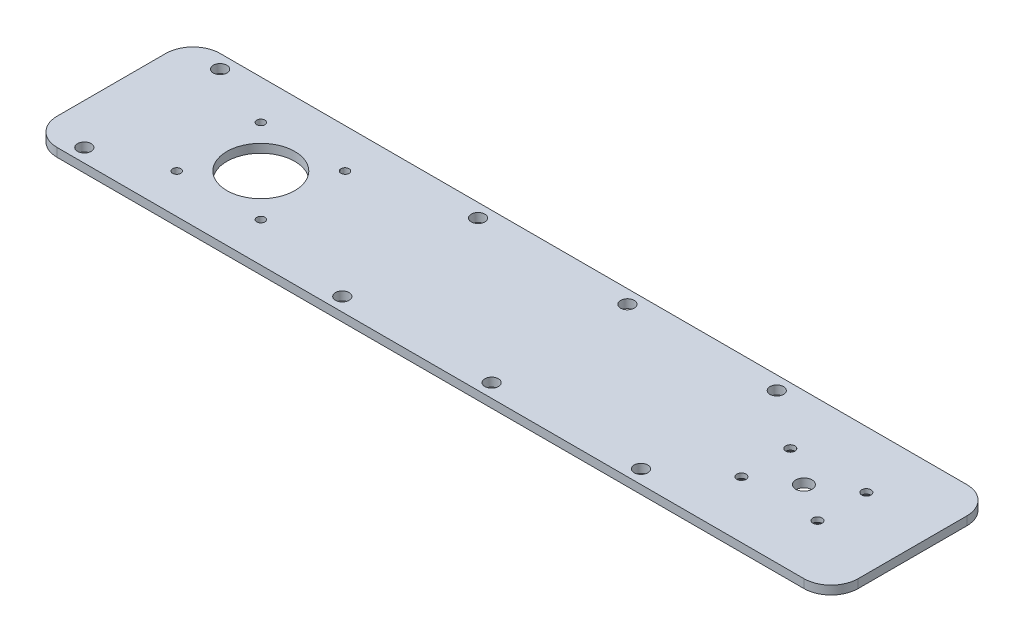
ISO-10303-21;
HEADER;
FILE_DESCRIPTION(('STEP AP214'),'2;1');
FILE_NAME('part.step','',(''),(''),'','','');
FILE_SCHEMA(('AUTOMOTIVE_DESIGN { 1 0 10303 214 1 1 1 1 }'));
ENDSEC;
DATA;
#1=APPLICATION_CONTEXT('core data for automotive mechanical design processes');
#2=APPLICATION_PROTOCOL_DEFINITION('international standard','automotive_design',2000,#1);
#3=PRODUCT_CONTEXT('',#1,'mechanical');
#4=PRODUCT('Part','Part','',(#3));
#5=PRODUCT_RELATED_PRODUCT_CATEGORY('part','',(#4));
#6=PRODUCT_DEFINITION_FORMATION('','',#4);
#7=PRODUCT_DEFINITION_CONTEXT('part definition',#1,'design');
#8=PRODUCT_DEFINITION('design','',#6,#7);
#9=PRODUCT_DEFINITION_SHAPE('','',#8);
#10=(LENGTH_UNIT() NAMED_UNIT(*) SI_UNIT(.MILLI.,.METRE.));
#11=(NAMED_UNIT(*) PLANE_ANGLE_UNIT() SI_UNIT($,.RADIAN.));
#12=(NAMED_UNIT(*) SI_UNIT($,.STERADIAN.) SOLID_ANGLE_UNIT());
#13=UNCERTAINTY_MEASURE_WITH_UNIT(LENGTH_MEASURE(1.E-05),#10,'distance_accuracy_value','');
#14=(GEOMETRIC_REPRESENTATION_CONTEXT(3) GLOBAL_UNCERTAINTY_ASSIGNED_CONTEXT((#13)) GLOBAL_UNIT_ASSIGNED_CONTEXT((#10,
#11,#12)) REPRESENTATION_CONTEXT('',''));
#15=CARTESIAN_POINT('',(0.,0.,0.));
#16=DIRECTION('',(0.,0.,1.));
#17=DIRECTION('',(1.,0.,0.));
#18=AXIS2_PLACEMENT_3D('',#15,#16,#17);
#19=CARTESIAN_POINT('',(0.,0.,0.));
#20=DIRECTION('',(0.,1.,0.));
#21=DIRECTION('',(0.,0.,1.));
#22=AXIS2_PLACEMENT_3D('',#19,#20,#21);
#23=PLANE('',#22);
#24=CARTESIAN_POINT('',(55.,0.,25.));
#25=DIRECTION('',(0.,1.,0.));
#26=DIRECTION('',(0.,0.,1.));
#27=AXIS2_PLACEMENT_3D('',#24,#25,#26);
#28=CIRCLE('',#27,2.5);
#29=CARTESIAN_POINT('',(55.,0.,27.5));
#30=VERTEX_POINT('',#29);
#31=EDGE_CURVE('E361',#30,#30,#28,.T.);
#32=ORIENTED_EDGE('',*,*,#31,.T.);
#33=EDGE_LOOP('',(#32));
#34=FACE_BOUND('',#33,.T.);
#35=CARTESIAN_POINT('',(110.,0.,25.));
#36=DIRECTION('',(0.,1.,0.));
#37=DIRECTION('',(0.,0.,1.));
#38=AXIS2_PLACEMENT_3D('',#35,#36,#37);
#39=CIRCLE('',#38,2.5);
#40=CARTESIAN_POINT('',(110.,0.,27.5));
#41=VERTEX_POINT('',#40);
#42=EDGE_CURVE('E353',#41,#41,#39,.T.);
#43=ORIENTED_EDGE('',*,*,#42,.T.);
#44=EDGE_LOOP('',(#43));
#45=FACE_BOUND('',#44,.T.);
#46=CARTESIAN_POINT('',(165.,0.,25.));
#47=DIRECTION('',(0.,1.,0.));
#48=DIRECTION('',(0.,0.,1.));
#49=AXIS2_PLACEMENT_3D('',#46,#47,#48);
#50=CIRCLE('',#49,2.5);
#51=CARTESIAN_POINT('',(165.,0.,27.5));
#52=VERTEX_POINT('',#51);
#53=EDGE_CURVE('E345',#52,#52,#50,.T.);
#54=ORIENTED_EDGE('',*,*,#53,.T.);
#55=EDGE_LOOP('',(#54));
#56=FACE_BOUND('',#55,.T.);
#57=CARTESIAN_POINT('',(165.,0.,-25.));
#58=DIRECTION('',(0.,1.,0.));
#59=DIRECTION('',(0.,0.,1.));
#60=AXIS2_PLACEMENT_3D('',#57,#58,#59);
#61=CIRCLE('',#60,2.5);
#62=CARTESIAN_POINT('',(165.,0.,-22.5));
#63=VERTEX_POINT('',#62);
#64=EDGE_CURVE('E337',#63,#63,#61,.T.);
#65=ORIENTED_EDGE('',*,*,#64,.T.);
#66=EDGE_LOOP('',(#65));
#67=FACE_BOUND('',#66,.T.);
#68=CARTESIAN_POINT('',(110.,0.,-25.));
#69=DIRECTION('',(0.,1.,0.));
#70=DIRECTION('',(0.,0.,1.));
#71=AXIS2_PLACEMENT_3D('',#68,#69,#70);
#72=CIRCLE('',#71,2.5);
#73=CARTESIAN_POINT('',(110.,0.,-22.5));
#74=VERTEX_POINT('',#73);
#75=EDGE_CURVE('E329',#74,#74,#72,.T.);
#76=ORIENTED_EDGE('',*,*,#75,.T.);
#77=EDGE_LOOP('',(#76));
#78=FACE_BOUND('',#77,.T.);
#79=CARTESIAN_POINT('',(55.,0.,-25.));
#80=DIRECTION('',(0.,1.,0.));
#81=DIRECTION('',(0.,0.,1.));
#82=AXIS2_PLACEMENT_3D('',#79,#80,#81);
#83=CIRCLE('',#82,2.5);
#84=CARTESIAN_POINT('',(55.,0.,-22.5));
#85=VERTEX_POINT('',#84);
#86=EDGE_CURVE('E321',#85,#85,#83,.T.);
#87=ORIENTED_EDGE('',*,*,#86,.T.);
#88=EDGE_LOOP('',(#87));
#89=FACE_BOUND('',#88,.T.);
#90=CARTESIAN_POINT('',(-40.,0.,25.));
#91=DIRECTION('',(0.,1.,0.));
#92=DIRECTION('',(0.,0.,1.));
#93=AXIS2_PLACEMENT_3D('',#90,#91,#92);
#94=CIRCLE('',#93,2.5);
#95=CARTESIAN_POINT('',(-40.,0.,27.5));
#96=VERTEX_POINT('',#95);
#97=EDGE_CURVE('E313',#96,#96,#94,.T.);
#98=ORIENTED_EDGE('',*,*,#97,.T.);
#99=EDGE_LOOP('',(#98));
#100=FACE_BOUND('',#99,.T.);
#101=CARTESIAN_POINT('',(-40.,0.,-25.));
#102=DIRECTION('',(0.,1.,0.));
#103=DIRECTION('',(0.,0.,1.));
#104=AXIS2_PLACEMENT_3D('',#101,#102,#103);
#105=CIRCLE('',#104,2.5);
#106=CARTESIAN_POINT('',(-40.,0.,-22.5));
#107=VERTEX_POINT('',#106);
#108=EDGE_CURVE('E305',#107,#107,#105,.T.);
#109=ORIENTED_EDGE('',*,*,#108,.T.);
#110=EDGE_LOOP('',(#109));
#111=FACE_BOUND('',#110,.T.);
#112=CARTESIAN_POINT('',(200.,0.,0.));
#113=DIRECTION('',(0.,1.,0.));
#114=DIRECTION('',(0.,0.,1.));
#115=AXIS2_PLACEMENT_3D('',#112,#113,#114);
#116=CIRCLE('',#115,3.);
#117=CARTESIAN_POINT('',(200.,0.,3.));
#118=VERTEX_POINT('',#117);
#119=EDGE_CURVE('E246',#118,#118,#116,.T.);
#120=ORIENTED_EDGE('',*,*,#119,.T.);
#121=EDGE_LOOP('',(#120));
#122=FACE_BOUND('',#121,.T.);
#123=CARTESIAN_POINT('',(0.,0.,0.));
#124=DIRECTION('',(0.,1.,0.));
#125=DIRECTION('',(0.,0.,1.));
#126=AXIS2_PLACEMENT_3D('',#123,#124,#125);
#127=CIRCLE('',#126,12.5);
#128=CARTESIAN_POINT('',(0.,0.,12.5));
#129=VERTEX_POINT('',#128);
#130=EDGE_CURVE('E241',#129,#129,#127,.T.);
#131=ORIENTED_EDGE('',*,*,#130,.T.);
#132=EDGE_LOOP('',(#131));
#133=FACE_BOUND('',#132,.T.);
#134=CARTESIAN_POINT('',(-15.5,0.,-15.5));
#135=DIRECTION('',(0.,1.,0.));
#136=DIRECTION('',(0.,0.,1.));
#137=AXIS2_PLACEMENT_3D('',#134,#135,#136);
#138=CIRCLE('',#137,1.5);
#139=CARTESIAN_POINT('',(-15.5,0.,-14.));
#140=VERTEX_POINT('',#139);
#141=EDGE_CURVE('E233',#140,#140,#138,.T.);
#142=ORIENTED_EDGE('',*,*,#141,.T.);
#143=EDGE_LOOP('',(#142));
#144=FACE_BOUND('',#143,.T.);
#145=CARTESIAN_POINT('',(15.5,0.,-15.5000000000002));
#146=DIRECTION('',(0.,1.,0.));
#147=DIRECTION('',(0.,0.,1.));
#148=AXIS2_PLACEMENT_3D('',#145,#146,#147);
#149=CIRCLE('',#148,1.5);
#150=CARTESIAN_POINT('',(15.5,0.,-14.0000000000002));
#151=VERTEX_POINT('',#150);
#152=EDGE_CURVE('E225',#151,#151,#149,.T.);
#153=ORIENTED_EDGE('',*,*,#152,.T.);
#154=EDGE_LOOP('',(#153));
#155=FACE_BOUND('',#154,.T.);
#156=CARTESIAN_POINT('',(15.5,0.,15.4999999999998));
#157=DIRECTION('',(0.,1.,0.));
#158=DIRECTION('',(0.,0.,1.));
#159=AXIS2_PLACEMENT_3D('',#156,#157,#158);
#160=CIRCLE('',#159,1.5);
#161=CARTESIAN_POINT('',(15.5,0.,16.9999999999998));
#162=VERTEX_POINT('',#161);
#163=EDGE_CURVE('E217',#162,#162,#160,.T.);
#164=ORIENTED_EDGE('',*,*,#163,.T.);
#165=EDGE_LOOP('',(#164));
#166=FACE_BOUND('',#165,.T.);
#167=CARTESIAN_POINT('',(-15.5,0.,15.5000000000002));
#168=DIRECTION('',(0.,1.,0.));
#169=DIRECTION('',(0.,0.,1.));
#170=AXIS2_PLACEMENT_3D('',#167,#168,#169);
#171=CIRCLE('',#170,1.5);
#172=CARTESIAN_POINT('',(-15.5,0.,17.0000000000002));
#173=VERTEX_POINT('',#172);
#174=EDGE_CURVE('E144',#173,#173,#171,.T.);
#175=ORIENTED_EDGE('',*,*,#174,.T.);
#176=EDGE_LOOP('',(#175));
#177=FACE_BOUND('',#176,.T.);
#178=DIRECTION('',(1.,0.,0.));
#179=VECTOR('',#178,1.);
#180=CARTESIAN_POINT('',(-55.,0.,30.));
#181=LINE('',#180,#179);
#182=CARTESIAN_POINT('',(-45.,0.,30.));
#183=VERTEX_POINT('',#182);
#184=CARTESIAN_POINT('',(230.,0.,30.));
#185=VERTEX_POINT('',#184);
#186=EDGE_CURVE('E124',#183,#185,#181,.T.);
#187=ORIENTED_EDGE('',*,*,#186,.F.);
#188=CARTESIAN_POINT('',(-45.,0.,20.));
#189=DIRECTION('',(0.,1.,0.));
#190=DIRECTION('',(0.,0.,1.));
#191=AXIS2_PLACEMENT_3D('',#188,#189,#190);
#192=CIRCLE('',#191,10.);
#193=CARTESIAN_POINT('',(-55.,0.,20.));
#194=VERTEX_POINT('',#193);
#195=EDGE_CURVE('E106',#183,#194,#192,.F.);
#196=ORIENTED_EDGE('',*,*,#195,.T.);
#197=DIRECTION('',(0.,0.,1.));
#198=VECTOR('',#197,1.);
#199=CARTESIAN_POINT('',(-55.,0.,-30.));
#200=LINE('',#199,#198);
#201=CARTESIAN_POINT('',(-55.,0.,-20.));
#202=VERTEX_POINT('',#201);
#203=EDGE_CURVE('E137',#202,#194,#200,.T.);
#204=ORIENTED_EDGE('',*,*,#203,.F.);
#205=CARTESIAN_POINT('',(-45.,0.,-20.));
#206=DIRECTION('',(0.,1.,0.));
#207=DIRECTION('',(0.,0.,1.));
#208=AXIS2_PLACEMENT_3D('',#205,#206,#207);
#209=CIRCLE('',#208,10.);
#210=CARTESIAN_POINT('',(-45.,0.,-30.));
#211=VERTEX_POINT('',#210);
#212=EDGE_CURVE('E118',#202,#211,#209,.F.);
#213=ORIENTED_EDGE('',*,*,#212,.T.);
#214=DIRECTION('',(-1.,0.,0.));
#215=VECTOR('',#214,1.);
#216=CARTESIAN_POINT('',(-55.,0.,-30.));
#217=LINE('',#216,#215);
#218=CARTESIAN_POINT('',(230.,0.,-30.));
#219=VERTEX_POINT('',#218);
#220=EDGE_CURVE('E142',#219,#211,#217,.T.);
#221=ORIENTED_EDGE('',*,*,#220,.F.);
#222=CARTESIAN_POINT('',(230.,0.,-20.));
#223=DIRECTION('',(0.,1.,0.));
#224=DIRECTION('',(0.,0.,1.));
#225=AXIS2_PLACEMENT_3D('',#222,#223,#224);
#226=CIRCLE('',#225,10.);
#227=CARTESIAN_POINT('',(240.,0.,-20.));
#228=VERTEX_POINT('',#227);
#229=EDGE_CURVE('E129',#219,#228,#226,.F.);
#230=ORIENTED_EDGE('',*,*,#229,.T.);
#231=DIRECTION('',(0.,0.,-1.));
#232=VECTOR('',#231,1.);
#233=CARTESIAN_POINT('',(240.,0.,-30.));
#234=LINE('',#233,#232);
#235=CARTESIAN_POINT('',(240.,0.,20.));
#236=VERTEX_POINT('',#235);
#237=EDGE_CURVE('E136',#236,#228,#234,.T.);
#238=ORIENTED_EDGE('',*,*,#237,.F.);
#239=CARTESIAN_POINT('',(230.,0.,20.));
#240=DIRECTION('',(0.,1.,0.));
#241=DIRECTION('',(0.,0.,1.));
#242=AXIS2_PLACEMENT_3D('',#239,#240,#241);
#243=CIRCLE('',#242,10.);
#244=EDGE_CURVE('E134',#236,#185,#243,.F.);
#245=ORIENTED_EDGE('',*,*,#244,.T.);
#246=EDGE_LOOP('',(#187,#196,#204,#213,#221,#230,#238,#245));
#247=FACE_BOUND('',#246,.T.);
#248=CARTESIAN_POINT('',(214.,0.,9.));
#249=DIRECTION('',(0.,-1.,0.));
#250=DIRECTION('',(0.,0.,-1.));
#251=AXIS2_PLACEMENT_3D('',#248,#249,#250);
#252=CIRCLE('',#251,3.15000000000001);
#253=CARTESIAN_POINT('',(214.,0.,5.84999999999999));
#254=VERTEX_POINT('',#253);
#255=EDGE_CURVE('E265',#254,#254,#252,.T.);
#256=ORIENTED_EDGE('',*,*,#255,.F.);
#257=EDGE_LOOP('',(#256));
#258=FACE_BOUND('',#257,.T.);
#259=CARTESIAN_POINT('',(186.,0.,9.));
#260=DIRECTION('',(0.,-1.,0.));
#261=DIRECTION('',(0.,0.,-1.));
#262=AXIS2_PLACEMENT_3D('',#259,#260,#261);
#263=CIRCLE('',#262,3.14999999999999);
#264=CARTESIAN_POINT('',(186.,0.,5.85000000000001));
#265=VERTEX_POINT('',#264);
#266=EDGE_CURVE('E277',#265,#265,#263,.T.);
#267=ORIENTED_EDGE('',*,*,#266,.F.);
#268=EDGE_LOOP('',(#267));
#269=FACE_BOUND('',#268,.T.);
#270=CARTESIAN_POINT('',(186.,0.,-9.));
#271=DIRECTION('',(0.,-1.,0.));
#272=DIRECTION('',(0.,0.,-1.));
#273=AXIS2_PLACEMENT_3D('',#270,#271,#272);
#274=CIRCLE('',#273,3.15000000000001);
#275=CARTESIAN_POINT('',(186.,0.,-12.15));
#276=VERTEX_POINT('',#275);
#277=EDGE_CURVE('E289',#276,#276,#274,.T.);
#278=ORIENTED_EDGE('',*,*,#277,.F.);
#279=EDGE_LOOP('',(#278));
#280=FACE_BOUND('',#279,.T.);
#281=CARTESIAN_POINT('',(214.,0.,-9.));
#282=DIRECTION('',(0.,-1.,0.));
#283=DIRECTION('',(0.,0.,-1.));
#284=AXIS2_PLACEMENT_3D('',#281,#282,#283);
#285=CIRCLE('',#284,3.14999999999999);
#286=CARTESIAN_POINT('',(214.,0.,-12.15));
#287=VERTEX_POINT('',#286);
#288=EDGE_CURVE('E301',#287,#287,#285,.T.);
#289=ORIENTED_EDGE('',*,*,#288,.F.);
#290=EDGE_LOOP('',(#289));
#291=FACE_BOUND('',#290,.T.);
#292=ADVANCED_FACE('F38',(#34,#45,#56,#67,#78,#89,#100,#111,#122,#133,#144,#155,#166,#177,#247,
#258,#269,#280,#291),#23,.F.);
#293=CARTESIAN_POINT('',(-55.,3.175,-30.));
#294=DIRECTION('',(1.,0.,0.));
#295=DIRECTION('',(0.,0.,-1.));
#296=AXIS2_PLACEMENT_3D('',#293,#294,#295);
#297=PLANE('',#296);
#298=ORIENTED_EDGE('',*,*,#203,.T.);
#299=DIRECTION('',(0.,-1.,0.));
#300=VECTOR('',#299,1.);
#301=CARTESIAN_POINT('',(-55.,3.175,20.));
#302=LINE('',#301,#300);
#303=CARTESIAN_POINT('',(-55.,3.175,20.));
#304=VERTEX_POINT('',#303);
#305=EDGE_CURVE('E111',#194,#304,#302,.F.);
#306=ORIENTED_EDGE('',*,*,#305,.T.);
#307=DIRECTION('',(0.,0.,1.));
#308=VECTOR('',#307,1.);
#309=CARTESIAN_POINT('',(-55.,3.175,-30.));
#310=LINE('',#309,#308);
#311=CARTESIAN_POINT('',(-55.,3.175,-20.));
#312=VERTEX_POINT('',#311);
#313=EDGE_CURVE('E150',#312,#304,#310,.T.);
#314=ORIENTED_EDGE('',*,*,#313,.F.);
#315=DIRECTION('',(0.,-1.,0.));
#316=VECTOR('',#315,1.);
#317=CARTESIAN_POINT('',(-55.,3.175,-20.));
#318=LINE('',#317,#316);
#319=EDGE_CURVE('E117',#312,#202,#318,.T.);
#320=ORIENTED_EDGE('',*,*,#319,.T.);
#321=EDGE_LOOP('',(#298,#306,#314,#320));
#322=FACE_BOUND('',#321,.T.);
#323=ADVANCED_FACE('F203',(#322),#297,.F.);
#324=CARTESIAN_POINT('',(-55.,3.175,30.));
#325=DIRECTION('',(0.,0.,-1.));
#326=DIRECTION('',(-1.,0.,0.));
#327=AXIS2_PLACEMENT_3D('',#324,#325,#326);
#328=PLANE('',#327);
#329=DIRECTION('',(1.,0.,0.));
#330=VECTOR('',#329,1.);
#331=CARTESIAN_POINT('',(-55.,3.175,30.));
#332=LINE('',#331,#330);
#333=CARTESIAN_POINT('',(-45.,3.175,30.));
#334=VERTEX_POINT('',#333);
#335=CARTESIAN_POINT('',(230.,3.175,30.));
#336=VERTEX_POINT('',#335);
#337=EDGE_CURVE('E127',#334,#336,#332,.T.);
#338=ORIENTED_EDGE('',*,*,#337,.F.);
#339=DIRECTION('',(0.,-1.,0.));
#340=VECTOR('',#339,1.);
#341=CARTESIAN_POINT('',(-45.,3.175,30.));
#342=LINE('',#341,#340);
#343=EDGE_CURVE('E110',#334,#183,#342,.T.);
#344=ORIENTED_EDGE('',*,*,#343,.T.);
#345=ORIENTED_EDGE('',*,*,#186,.T.);
#346=DIRECTION('',(0.,-1.,0.));
#347=VECTOR('',#346,1.);
#348=CARTESIAN_POINT('',(230.,3.175,30.));
#349=LINE('',#348,#347);
#350=EDGE_CURVE('E130',#185,#336,#349,.F.);
#351=ORIENTED_EDGE('',*,*,#350,.T.);
#352=EDGE_LOOP('',(#338,#344,#345,#351));
#353=FACE_BOUND('',#352,.T.);
#354=ADVANCED_FACE('F123',(#353),#328,.F.);
#355=CARTESIAN_POINT('',(240.,3.175,-30.));
#356=DIRECTION('',(-1.,0.,0.));
#357=DIRECTION('',(0.,0.,1.));
#358=AXIS2_PLACEMENT_3D('',#355,#356,#357);
#359=PLANE('',#358);
#360=DIRECTION('',(0.,0.,-1.));
#361=VECTOR('',#360,1.);
#362=CARTESIAN_POINT('',(240.,3.175,-30.));
#363=LINE('',#362,#361);
#364=CARTESIAN_POINT('',(240.,3.175,20.));
#365=VERTEX_POINT('',#364);
#366=CARTESIAN_POINT('',(240.,3.175,-20.));
#367=VERTEX_POINT('',#366);
#368=EDGE_CURVE('E186',#365,#367,#363,.T.);
#369=ORIENTED_EDGE('',*,*,#368,.F.);
#370=DIRECTION('',(0.,-1.,0.));
#371=VECTOR('',#370,1.);
#372=CARTESIAN_POINT('',(240.,3.175,20.));
#373=LINE('',#372,#371);
#374=EDGE_CURVE('E11',#365,#236,#373,.T.);
#375=ORIENTED_EDGE('',*,*,#374,.T.);
#376=ORIENTED_EDGE('',*,*,#237,.T.);
#377=DIRECTION('',(0.,-1.,0.));
#378=VECTOR('',#377,1.);
#379=CARTESIAN_POINT('',(240.,3.175,-20.));
#380=LINE('',#379,#378);
#381=EDGE_CURVE('E47',#228,#367,#380,.F.);
#382=ORIENTED_EDGE('',*,*,#381,.T.);
#383=EDGE_LOOP('',(#369,#375,#376,#382));
#384=FACE_BOUND('',#383,.T.);
#385=ADVANCED_FACE('F185',(#384),#359,.F.);
#386=CARTESIAN_POINT('',(-55.,3.175,-30.));
#387=DIRECTION('',(0.,0.,1.));
#388=DIRECTION('',(1.,0.,0.));
#389=AXIS2_PLACEMENT_3D('',#386,#387,#388);
#390=PLANE('',#389);
#391=ORIENTED_EDGE('',*,*,#220,.T.);
#392=DIRECTION('',(0.,-1.,0.));
#393=VECTOR('',#392,1.);
#394=CARTESIAN_POINT('',(-45.,3.175,-30.));
#395=LINE('',#394,#393);
#396=CARTESIAN_POINT('',(-45.,3.175,-30.));
#397=VERTEX_POINT('',#396);
#398=EDGE_CURVE('E54',#211,#397,#395,.F.);
#399=ORIENTED_EDGE('',*,*,#398,.T.);
#400=DIRECTION('',(-1.,0.,0.));
#401=VECTOR('',#400,1.);
#402=CARTESIAN_POINT('',(-55.,3.175,-30.));
#403=LINE('',#402,#401);
#404=CARTESIAN_POINT('',(230.,3.175,-30.));
#405=VERTEX_POINT('',#404);
#406=EDGE_CURVE('E152',#405,#397,#403,.T.);
#407=ORIENTED_EDGE('',*,*,#406,.F.);
#408=DIRECTION('',(0.,-1.,0.));
#409=VECTOR('',#408,1.);
#410=CARTESIAN_POINT('',(230.,3.175,-30.));
#411=LINE('',#410,#409);
#412=EDGE_CURVE('E176',#405,#219,#411,.T.);
#413=ORIENTED_EDGE('',*,*,#412,.T.);
#414=EDGE_LOOP('',(#391,#399,#407,#413));
#415=FACE_BOUND('',#414,.T.);
#416=ADVANCED_FACE('F196',(#415),#390,.F.);
#417=CARTESIAN_POINT('',(0.,3.175,0.));
#418=DIRECTION('',(0.,1.,0.));
#419=DIRECTION('',(0.,0.,1.));
#420=AXIS2_PLACEMENT_3D('',#417,#418,#419);
#421=PLANE('',#420);
#422=CARTESIAN_POINT('',(55.,3.175,25.));
#423=DIRECTION('',(0.,1.,0.));
#424=DIRECTION('',(0.,0.,1.));
#425=AXIS2_PLACEMENT_3D('',#422,#423,#424);
#426=CIRCLE('',#425,2.5);
#427=CARTESIAN_POINT('',(55.,3.175,27.5));
#428=VERTEX_POINT('',#427);
#429=EDGE_CURVE('E365',#428,#428,#426,.T.);
#430=ORIENTED_EDGE('',*,*,#429,.F.);
#431=EDGE_LOOP('',(#430));
#432=FACE_BOUND('',#431,.T.);
#433=CARTESIAN_POINT('',(110.,3.175,25.));
#434=DIRECTION('',(0.,1.,0.));
#435=DIRECTION('',(0.,0.,1.));
#436=AXIS2_PLACEMENT_3D('',#433,#434,#435);
#437=CIRCLE('',#436,2.5);
#438=CARTESIAN_POINT('',(110.,3.175,27.5));
#439=VERTEX_POINT('',#438);
#440=EDGE_CURVE('E357',#439,#439,#437,.T.);
#441=ORIENTED_EDGE('',*,*,#440,.F.);
#442=EDGE_LOOP('',(#441));
#443=FACE_BOUND('',#442,.T.);
#444=CARTESIAN_POINT('',(165.,3.175,25.));
#445=DIRECTION('',(0.,1.,0.));
#446=DIRECTION('',(0.,0.,1.));
#447=AXIS2_PLACEMENT_3D('',#444,#445,#446);
#448=CIRCLE('',#447,2.5);
#449=CARTESIAN_POINT('',(165.,3.175,27.5));
#450=VERTEX_POINT('',#449);
#451=EDGE_CURVE('E349',#450,#450,#448,.T.);
#452=ORIENTED_EDGE('',*,*,#451,.F.);
#453=EDGE_LOOP('',(#452));
#454=FACE_BOUND('',#453,.T.);
#455=CARTESIAN_POINT('',(165.,3.175,-25.));
#456=DIRECTION('',(0.,1.,0.));
#457=DIRECTION('',(0.,0.,1.));
#458=AXIS2_PLACEMENT_3D('',#455,#456,#457);
#459=CIRCLE('',#458,2.5);
#460=CARTESIAN_POINT('',(165.,3.175,-22.5));
#461=VERTEX_POINT('',#460);
#462=EDGE_CURVE('E341',#461,#461,#459,.T.);
#463=ORIENTED_EDGE('',*,*,#462,.F.);
#464=EDGE_LOOP('',(#463));
#465=FACE_BOUND('',#464,.T.);
#466=CARTESIAN_POINT('',(110.,3.175,-25.));
#467=DIRECTION('',(0.,1.,0.));
#468=DIRECTION('',(0.,0.,1.));
#469=AXIS2_PLACEMENT_3D('',#466,#467,#468);
#470=CIRCLE('',#469,2.5);
#471=CARTESIAN_POINT('',(110.,3.175,-22.5));
#472=VERTEX_POINT('',#471);
#473=EDGE_CURVE('E333',#472,#472,#470,.T.);
#474=ORIENTED_EDGE('',*,*,#473,.F.);
#475=EDGE_LOOP('',(#474));
#476=FACE_BOUND('',#475,.T.);
#477=CARTESIAN_POINT('',(55.,3.175,-25.));
#478=DIRECTION('',(0.,1.,0.));
#479=DIRECTION('',(0.,0.,1.));
#480=AXIS2_PLACEMENT_3D('',#477,#478,#479);
#481=CIRCLE('',#480,2.5);
#482=CARTESIAN_POINT('',(55.,3.175,-22.5));
#483=VERTEX_POINT('',#482);
#484=EDGE_CURVE('E325',#483,#483,#481,.T.);
#485=ORIENTED_EDGE('',*,*,#484,.F.);
#486=EDGE_LOOP('',(#485));
#487=FACE_BOUND('',#486,.T.);
#488=CARTESIAN_POINT('',(-40.,3.175,25.));
#489=DIRECTION('',(0.,1.,0.));
#490=DIRECTION('',(0.,0.,1.));
#491=AXIS2_PLACEMENT_3D('',#488,#489,#490);
#492=CIRCLE('',#491,2.5);
#493=CARTESIAN_POINT('',(-40.,3.175,27.5));
#494=VERTEX_POINT('',#493);
#495=EDGE_CURVE('E317',#494,#494,#492,.T.);
#496=ORIENTED_EDGE('',*,*,#495,.F.);
#497=EDGE_LOOP('',(#496));
#498=FACE_BOUND('',#497,.T.);
#499=CARTESIAN_POINT('',(-40.,3.175,-25.));
#500=DIRECTION('',(0.,1.,0.));
#501=DIRECTION('',(0.,0.,1.));
#502=AXIS2_PLACEMENT_3D('',#499,#500,#501);
#503=CIRCLE('',#502,2.5);
#504=CARTESIAN_POINT('',(-40.,3.175,-22.5));
#505=VERTEX_POINT('',#504);
#506=EDGE_CURVE('E309',#505,#505,#503,.T.);
#507=ORIENTED_EDGE('',*,*,#506,.F.);
#508=EDGE_LOOP('',(#507));
#509=FACE_BOUND('',#508,.T.);
#510=CARTESIAN_POINT('',(214.,3.175,-9.));
#511=DIRECTION('',(0.,1.,0.));
#512=DIRECTION('',(0.,0.,1.));
#513=AXIS2_PLACEMENT_3D('',#510,#511,#512);
#514=CIRCLE('',#513,1.70000000000001);
#515=CARTESIAN_POINT('',(214.,3.175,-7.29999999999999));
#516=VERTEX_POINT('',#515);
#517=EDGE_CURVE('E293',#516,#516,#514,.T.);
#518=ORIENTED_EDGE('',*,*,#517,.F.);
#519=EDGE_LOOP('',(#518));
#520=FACE_BOUND('',#519,.T.);
#521=CARTESIAN_POINT('',(186.,3.175,-9.));
#522=DIRECTION('',(0.,1.,0.));
#523=DIRECTION('',(0.,0.,1.));
#524=AXIS2_PLACEMENT_3D('',#521,#522,#523);
#525=CIRCLE('',#524,1.70000000000001);
#526=CARTESIAN_POINT('',(186.,3.175,-7.29999999999999));
#527=VERTEX_POINT('',#526);
#528=EDGE_CURVE('E281',#527,#527,#525,.T.);
#529=ORIENTED_EDGE('',*,*,#528,.F.);
#530=EDGE_LOOP('',(#529));
#531=FACE_BOUND('',#530,.T.);
#532=CARTESIAN_POINT('',(186.,3.175,9.));
#533=DIRECTION('',(0.,1.,0.));
#534=DIRECTION('',(0.,0.,1.));
#535=AXIS2_PLACEMENT_3D('',#532,#533,#534);
#536=CIRCLE('',#535,1.70000000000001);
#537=CARTESIAN_POINT('',(186.,3.175,10.7));
#538=VERTEX_POINT('',#537);
#539=EDGE_CURVE('E269',#538,#538,#536,.T.);
#540=ORIENTED_EDGE('',*,*,#539,.F.);
#541=EDGE_LOOP('',(#540));
#542=FACE_BOUND('',#541,.T.);
#543=CARTESIAN_POINT('',(214.,3.175,9.));
#544=DIRECTION('',(0.,1.,0.));
#545=DIRECTION('',(0.,0.,1.));
#546=AXIS2_PLACEMENT_3D('',#543,#544,#545);
#547=CIRCLE('',#546,1.70000000000001);
#548=CARTESIAN_POINT('',(214.,3.175,10.7));
#549=VERTEX_POINT('',#548);
#550=EDGE_CURVE('E257',#549,#549,#547,.T.);
#551=ORIENTED_EDGE('',*,*,#550,.F.);
#552=EDGE_LOOP('',(#551));
#553=FACE_BOUND('',#552,.T.);
#554=CARTESIAN_POINT('',(200.,3.175,0.));
#555=DIRECTION('',(0.,1.,0.));
#556=DIRECTION('',(0.,0.,1.));
#557=AXIS2_PLACEMENT_3D('',#554,#555,#556);
#558=CIRCLE('',#557,3.);
#559=CARTESIAN_POINT('',(200.,3.175,3.));
#560=VERTEX_POINT('',#559);
#561=EDGE_CURVE('E253',#560,#560,#558,.T.);
#562=ORIENTED_EDGE('',*,*,#561,.F.);
#563=EDGE_LOOP('',(#562));
#564=FACE_BOUND('',#563,.T.);
#565=CARTESIAN_POINT('',(0.,3.175,0.));
#566=DIRECTION('',(0.,1.,0.));
#567=DIRECTION('',(0.,0.,1.));
#568=AXIS2_PLACEMENT_3D('',#565,#566,#567);
#569=CIRCLE('',#568,12.5);
#570=CARTESIAN_POINT('',(0.,3.175,12.5));
#571=VERTEX_POINT('',#570);
#572=EDGE_CURVE('E242',#571,#571,#569,.T.);
#573=ORIENTED_EDGE('',*,*,#572,.F.);
#574=EDGE_LOOP('',(#573));
#575=FACE_BOUND('',#574,.T.);
#576=CARTESIAN_POINT('',(-15.5,3.175,-15.5));
#577=DIRECTION('',(0.,1.,0.));
#578=DIRECTION('',(0.,0.,1.));
#579=AXIS2_PLACEMENT_3D('',#576,#577,#578);
#580=CIRCLE('',#579,1.5);
#581=CARTESIAN_POINT('',(-15.5,3.175,-14.));
#582=VERTEX_POINT('',#581);
#583=EDGE_CURVE('E237',#582,#582,#580,.T.);
#584=ORIENTED_EDGE('',*,*,#583,.F.);
#585=EDGE_LOOP('',(#584));
#586=FACE_BOUND('',#585,.T.);
#587=CARTESIAN_POINT('',(15.5,3.175,-15.5000000000002));
#588=DIRECTION('',(0.,1.,0.));
#589=DIRECTION('',(0.,0.,1.));
#590=AXIS2_PLACEMENT_3D('',#587,#588,#589);
#591=CIRCLE('',#590,1.5);
#592=CARTESIAN_POINT('',(15.5,3.175,-14.0000000000002));
#593=VERTEX_POINT('',#592);
#594=EDGE_CURVE('E229',#593,#593,#591,.T.);
#595=ORIENTED_EDGE('',*,*,#594,.F.);
#596=EDGE_LOOP('',(#595));
#597=FACE_BOUND('',#596,.T.);
#598=CARTESIAN_POINT('',(15.5,3.175,15.4999999999998));
#599=DIRECTION('',(0.,1.,0.));
#600=DIRECTION('',(0.,0.,1.));
#601=AXIS2_PLACEMENT_3D('',#598,#599,#600);
#602=CIRCLE('',#601,1.5);
#603=CARTESIAN_POINT('',(15.5,3.175,16.9999999999998));
#604=VERTEX_POINT('',#603);
#605=EDGE_CURVE('E221',#604,#604,#602,.T.);
#606=ORIENTED_EDGE('',*,*,#605,.F.);
#607=EDGE_LOOP('',(#606));
#608=FACE_BOUND('',#607,.T.);
#609=CARTESIAN_POINT('',(-15.5,3.175,15.5000000000002));
#610=DIRECTION('',(0.,1.,0.));
#611=DIRECTION('',(0.,0.,1.));
#612=AXIS2_PLACEMENT_3D('',#609,#610,#611);
#613=CIRCLE('',#612,1.5);
#614=CARTESIAN_POINT('',(-15.5,3.175,17.0000000000002));
#615=VERTEX_POINT('',#614);
#616=EDGE_CURVE('E213',#615,#615,#613,.T.);
#617=ORIENTED_EDGE('',*,*,#616,.F.);
#618=EDGE_LOOP('',(#617));
#619=FACE_BOUND('',#618,.T.);
#620=ORIENTED_EDGE('',*,*,#313,.T.);
#621=CARTESIAN_POINT('',(-45.,3.175,20.));
#622=DIRECTION('',(0.,1.,0.));
#623=DIRECTION('',(0.,0.,1.));
#624=AXIS2_PLACEMENT_3D('',#621,#622,#623);
#625=CIRCLE('',#624,10.);
#626=EDGE_CURVE('E173',#304,#334,#625,.T.);
#627=ORIENTED_EDGE('',*,*,#626,.T.);
#628=ORIENTED_EDGE('',*,*,#337,.T.);
#629=CARTESIAN_POINT('',(230.,3.175,20.));
#630=DIRECTION('',(0.,1.,0.));
#631=DIRECTION('',(0.,0.,1.));
#632=AXIS2_PLACEMENT_3D('',#629,#630,#631);
#633=CIRCLE('',#632,10.);
#634=EDGE_CURVE('E167',#336,#365,#633,.T.);
#635=ORIENTED_EDGE('',*,*,#634,.T.);
#636=ORIENTED_EDGE('',*,*,#368,.T.);
#637=CARTESIAN_POINT('',(230.,3.175,-20.));
#638=DIRECTION('',(0.,1.,0.));
#639=DIRECTION('',(0.,0.,1.));
#640=AXIS2_PLACEMENT_3D('',#637,#638,#639);
#641=CIRCLE('',#640,10.);
#642=EDGE_CURVE('E61',#367,#405,#641,.T.);
#643=ORIENTED_EDGE('',*,*,#642,.T.);
#644=ORIENTED_EDGE('',*,*,#406,.T.);
#645=CARTESIAN_POINT('',(-45.,3.175,-20.));
#646=DIRECTION('',(0.,1.,0.));
#647=DIRECTION('',(0.,0.,1.));
#648=AXIS2_PLACEMENT_3D('',#645,#646,#647);
#649=CIRCLE('',#648,10.);
#650=EDGE_CURVE('E170',#397,#312,#649,.T.);
#651=ORIENTED_EDGE('',*,*,#650,.T.);
#652=EDGE_LOOP('',(#620,#627,#628,#635,#636,#643,#644,#651));
#653=FACE_BOUND('',#652,.T.);
#654=ADVANCED_FACE('F190',(#432,#443,#454,#465,#476,#487,#498,#509,#520,#531,#542,#553,#564,
#575,#586,#597,#608,#619,#653),#421,.T.);
#655=CARTESIAN_POINT('',(-45.,3.175,20.));
#656=DIRECTION('',(0.,-1.,0.));
#657=DIRECTION('',(0.,0.,-1.));
#658=AXIS2_PLACEMENT_3D('',#655,#656,#657);
#659=CYLINDRICAL_SURFACE('',#658,10.);
#660=ORIENTED_EDGE('',*,*,#626,.F.);
#661=ORIENTED_EDGE('',*,*,#305,.F.);
#662=ORIENTED_EDGE('',*,*,#195,.F.);
#663=ORIENTED_EDGE('',*,*,#343,.F.);
#664=EDGE_LOOP('',(#660,#661,#662,#663));
#665=FACE_BOUND('',#664,.T.);
#666=ADVANCED_FACE('F109',(#665),#659,.T.);
#667=CARTESIAN_POINT('',(-45.,3.175,-20.));
#668=DIRECTION('',(0.,-1.,0.));
#669=DIRECTION('',(0.,0.,-1.));
#670=AXIS2_PLACEMENT_3D('',#667,#668,#669);
#671=CYLINDRICAL_SURFACE('',#670,10.);
#672=ORIENTED_EDGE('',*,*,#650,.F.);
#673=ORIENTED_EDGE('',*,*,#398,.F.);
#674=ORIENTED_EDGE('',*,*,#212,.F.);
#675=ORIENTED_EDGE('',*,*,#319,.F.);
#676=EDGE_LOOP('',(#672,#673,#674,#675));
#677=FACE_BOUND('',#676,.T.);
#678=ADVANCED_FACE('F200',(#677),#671,.T.);
#679=CARTESIAN_POINT('',(230.,3.175,20.));
#680=DIRECTION('',(0.,-1.,0.));
#681=DIRECTION('',(0.,0.,-1.));
#682=AXIS2_PLACEMENT_3D('',#679,#680,#681);
#683=CYLINDRICAL_SURFACE('',#682,10.);
#684=ORIENTED_EDGE('',*,*,#634,.F.);
#685=ORIENTED_EDGE('',*,*,#350,.F.);
#686=ORIENTED_EDGE('',*,*,#244,.F.);
#687=ORIENTED_EDGE('',*,*,#374,.F.);
#688=EDGE_LOOP('',(#684,#685,#686,#687));
#689=FACE_BOUND('',#688,.T.);
#690=ADVANCED_FACE('F421',(#689),#683,.T.);
#691=CARTESIAN_POINT('',(230.,3.175,-20.));
#692=DIRECTION('',(0.,-1.,0.));
#693=DIRECTION('',(0.,0.,-1.));
#694=AXIS2_PLACEMENT_3D('',#691,#692,#693);
#695=CYLINDRICAL_SURFACE('',#694,10.);
#696=ORIENTED_EDGE('',*,*,#642,.F.);
#697=ORIENTED_EDGE('',*,*,#381,.F.);
#698=ORIENTED_EDGE('',*,*,#229,.F.);
#699=ORIENTED_EDGE('',*,*,#412,.F.);
#700=EDGE_LOOP('',(#696,#697,#698,#699));
#701=FACE_BOUND('',#700,.T.);
#702=ADVANCED_FACE('F40',(#701),#695,.T.);
#703=CARTESIAN_POINT('',(-15.5,3.175,15.5000000000002));
#704=DIRECTION('',(0.,1.,0.));
#705=DIRECTION('',(0.,0.,1.));
#706=AXIS2_PLACEMENT_3D('',#703,#704,#705);
#707=CYLINDRICAL_SURFACE('',#706,1.5);
#708=ORIENTED_EDGE('',*,*,#174,.F.);
#709=EDGE_LOOP('',(#708));
#710=FACE_BOUND('',#709,.T.);
#711=ORIENTED_EDGE('',*,*,#616,.T.);
#712=EDGE_LOOP('',(#711));
#713=FACE_BOUND('',#712,.T.);
#714=ADVANCED_FACE('F409',(#710,#713),#707,.F.);
#715=CARTESIAN_POINT('',(15.5,3.175,15.4999999999998));
#716=DIRECTION('',(0.,1.,0.));
#717=DIRECTION('',(0.,0.,1.));
#718=AXIS2_PLACEMENT_3D('',#715,#716,#717);
#719=CYLINDRICAL_SURFACE('',#718,1.5);
#720=ORIENTED_EDGE('',*,*,#163,.F.);
#721=EDGE_LOOP('',(#720));
#722=FACE_BOUND('',#721,.T.);
#723=ORIENTED_EDGE('',*,*,#605,.T.);
#724=EDGE_LOOP('',(#723));
#725=FACE_BOUND('',#724,.T.);
#726=ADVANCED_FACE('F411',(#722,#725),#719,.F.);
#727=CARTESIAN_POINT('',(15.5,3.175,-15.5000000000002));
#728=DIRECTION('',(0.,1.,0.));
#729=DIRECTION('',(0.,0.,1.));
#730=AXIS2_PLACEMENT_3D('',#727,#728,#729);
#731=CYLINDRICAL_SURFACE('',#730,1.5);
#732=ORIENTED_EDGE('',*,*,#152,.F.);
#733=EDGE_LOOP('',(#732));
#734=FACE_BOUND('',#733,.T.);
#735=ORIENTED_EDGE('',*,*,#594,.T.);
#736=EDGE_LOOP('',(#735));
#737=FACE_BOUND('',#736,.T.);
#738=ADVANCED_FACE('F418',(#734,#737),#731,.F.);
#739=CARTESIAN_POINT('',(-15.5,3.175,-15.5));
#740=DIRECTION('',(0.,1.,0.));
#741=DIRECTION('',(0.,0.,1.));
#742=AXIS2_PLACEMENT_3D('',#739,#740,#741);
#743=CYLINDRICAL_SURFACE('',#742,1.5);
#744=ORIENTED_EDGE('',*,*,#141,.F.);
#745=EDGE_LOOP('',(#744));
#746=FACE_BOUND('',#745,.T.);
#747=ORIENTED_EDGE('',*,*,#583,.T.);
#748=EDGE_LOOP('',(#747));
#749=FACE_BOUND('',#748,.T.);
#750=ADVANCED_FACE('F470',(#746,#749),#743,.F.);
#751=CARTESIAN_POINT('',(0.,0.,0.));
#752=DIRECTION('',(0.,1.,0.));
#753=DIRECTION('',(0.,0.,1.));
#754=AXIS2_PLACEMENT_3D('',#751,#752,#753);
#755=CYLINDRICAL_SURFACE('',#754,12.5);
#756=ORIENTED_EDGE('',*,*,#130,.F.);
#757=EDGE_LOOP('',(#756));
#758=FACE_BOUND('',#757,.T.);
#759=ORIENTED_EDGE('',*,*,#572,.T.);
#760=EDGE_LOOP('',(#759));
#761=FACE_BOUND('',#760,.T.);
#762=ADVANCED_FACE('F480',(#758,#761),#755,.F.);
#763=CARTESIAN_POINT('',(200.,3.175,0.));
#764=DIRECTION('',(0.,1.,0.));
#765=DIRECTION('',(0.,0.,1.));
#766=AXIS2_PLACEMENT_3D('',#763,#764,#765);
#767=CYLINDRICAL_SURFACE('',#766,3.);
#768=ORIENTED_EDGE('',*,*,#119,.F.);
#769=EDGE_LOOP('',(#768));
#770=FACE_BOUND('',#769,.T.);
#771=ORIENTED_EDGE('',*,*,#561,.T.);
#772=EDGE_LOOP('',(#771));
#773=FACE_BOUND('',#772,.T.);
#774=ADVANCED_FACE('F490',(#770,#773),#767,.F.);
#775=CARTESIAN_POINT('',(214.,0.,9.));
#776=DIRECTION('',(0.,-1.,0.));
#777=DIRECTION('',(0.,0.,-1.));
#778=AXIS2_PLACEMENT_3D('',#775,#776,#777);
#779=CYLINDRICAL_SURFACE('',#778,1.70000000000001);
#780=CARTESIAN_POINT('',(214.,1.45,9.));
#781=DIRECTION('',(0.,-1.,0.));
#782=DIRECTION('',(0.,0.,-1.));
#783=AXIS2_PLACEMENT_3D('',#780,#781,#782);
#784=CIRCLE('',#783,1.70000000000001);
#785=CARTESIAN_POINT('',(214.,1.45,7.29999999999999));
#786=VERTEX_POINT('',#785);
#787=EDGE_CURVE('E261',#786,#786,#784,.T.);
#788=ORIENTED_EDGE('',*,*,#787,.T.);
#789=EDGE_LOOP('',(#788));
#790=FACE_BOUND('',#789,.T.);
#791=ORIENTED_EDGE('',*,*,#550,.T.);
#792=EDGE_LOOP('',(#791));
#793=FACE_BOUND('',#792,.T.);
#794=ADVANCED_FACE('F500',(#790,#793),#779,.F.);
#795=CARTESIAN_POINT('',(214.,0.,9.));
#796=DIRECTION('',(0.,-1.,0.));
#797=DIRECTION('',(0.,0.,-1.));
#798=AXIS2_PLACEMENT_3D('',#795,#796,#797);
#799=CONICAL_SURFACE('',#798,3.15000000000001,0.78539816339745);
#800=ORIENTED_EDGE('',*,*,#787,.F.);
#801=EDGE_LOOP('',(#800));
#802=FACE_BOUND('',#801,.T.);
#803=ORIENTED_EDGE('',*,*,#255,.T.);
#804=EDGE_LOOP('',(#803));
#805=FACE_BOUND('',#804,.T.);
#806=ADVANCED_FACE('F511',(#802,#805),#799,.F.);
#807=CARTESIAN_POINT('',(186.,0.,9.));
#808=DIRECTION('',(0.,-1.,0.));
#809=DIRECTION('',(0.,0.,-1.));
#810=AXIS2_PLACEMENT_3D('',#807,#808,#809);
#811=CYLINDRICAL_SURFACE('',#810,1.70000000000001);
#812=CARTESIAN_POINT('',(186.,1.45,9.));
#813=DIRECTION('',(0.,-1.,0.));
#814=DIRECTION('',(0.,0.,-1.));
#815=AXIS2_PLACEMENT_3D('',#812,#813,#814);
#816=CIRCLE('',#815,1.70000000000001);
#817=CARTESIAN_POINT('',(186.,1.45,7.29999999999999));
#818=VERTEX_POINT('',#817);
#819=EDGE_CURVE('E273',#818,#818,#816,.T.);
#820=ORIENTED_EDGE('',*,*,#819,.T.);
#821=EDGE_LOOP('',(#820));
#822=FACE_BOUND('',#821,.T.);
#823=ORIENTED_EDGE('',*,*,#539,.T.);
#824=EDGE_LOOP('',(#823));
#825=FACE_BOUND('',#824,.T.);
#826=ADVANCED_FACE('F521',(#822,#825),#811,.F.);
#827=CARTESIAN_POINT('',(186.,0.,9.));
#828=DIRECTION('',(0.,-1.,0.));
#829=DIRECTION('',(0.,0.,-1.));
#830=AXIS2_PLACEMENT_3D('',#827,#828,#829);
#831=CONICAL_SURFACE('',#830,3.14999999999999,0.785398163397441);
#832=ORIENTED_EDGE('',*,*,#819,.F.);
#833=EDGE_LOOP('',(#832));
#834=FACE_BOUND('',#833,.T.);
#835=ORIENTED_EDGE('',*,*,#266,.T.);
#836=EDGE_LOOP('',(#835));
#837=FACE_BOUND('',#836,.T.);
#838=ADVANCED_FACE('F531',(#834,#837),#831,.F.);
#839=CARTESIAN_POINT('',(186.,0.,-9.));
#840=DIRECTION('',(0.,-1.,0.));
#841=DIRECTION('',(0.,0.,-1.));
#842=AXIS2_PLACEMENT_3D('',#839,#840,#841);
#843=CYLINDRICAL_SURFACE('',#842,1.70000000000001);
#844=CARTESIAN_POINT('',(186.,1.45,-9.));
#845=DIRECTION('',(0.,-1.,0.));
#846=DIRECTION('',(0.,0.,-1.));
#847=AXIS2_PLACEMENT_3D('',#844,#845,#846);
#848=CIRCLE('',#847,1.70000000000001);
#849=CARTESIAN_POINT('',(186.,1.45,-10.7));
#850=VERTEX_POINT('',#849);
#851=EDGE_CURVE('E285',#850,#850,#848,.T.);
#852=ORIENTED_EDGE('',*,*,#851,.T.);
#853=EDGE_LOOP('',(#852));
#854=FACE_BOUND('',#853,.T.);
#855=ORIENTED_EDGE('',*,*,#528,.T.);
#856=EDGE_LOOP('',(#855));
#857=FACE_BOUND('',#856,.T.);
#858=ADVANCED_FACE('F541',(#854,#857),#843,.F.);
#859=CARTESIAN_POINT('',(186.,0.,-9.));
#860=DIRECTION('',(0.,-1.,0.));
#861=DIRECTION('',(0.,0.,-1.));
#862=AXIS2_PLACEMENT_3D('',#859,#860,#861);
#863=CONICAL_SURFACE('',#862,3.15000000000001,0.78539816339745);
#864=ORIENTED_EDGE('',*,*,#851,.F.);
#865=EDGE_LOOP('',(#864));
#866=FACE_BOUND('',#865,.T.);
#867=ORIENTED_EDGE('',*,*,#277,.T.);
#868=EDGE_LOOP('',(#867));
#869=FACE_BOUND('',#868,.T.);
#870=ADVANCED_FACE('F551',(#866,#869),#863,.F.);
#871=CARTESIAN_POINT('',(214.,0.,-9.));
#872=DIRECTION('',(0.,-1.,0.));
#873=DIRECTION('',(0.,0.,-1.));
#874=AXIS2_PLACEMENT_3D('',#871,#872,#873);
#875=CYLINDRICAL_SURFACE('',#874,1.70000000000001);
#876=CARTESIAN_POINT('',(214.,1.45,-9.));
#877=DIRECTION('',(0.,-1.,0.));
#878=DIRECTION('',(0.,0.,-1.));
#879=AXIS2_PLACEMENT_3D('',#876,#877,#878);
#880=CIRCLE('',#879,1.70000000000001);
#881=CARTESIAN_POINT('',(214.,1.45,-10.7));
#882=VERTEX_POINT('',#881);
#883=EDGE_CURVE('E297',#882,#882,#880,.T.);
#884=ORIENTED_EDGE('',*,*,#883,.T.);
#885=EDGE_LOOP('',(#884));
#886=FACE_BOUND('',#885,.T.);
#887=ORIENTED_EDGE('',*,*,#517,.T.);
#888=EDGE_LOOP('',(#887));
#889=FACE_BOUND('',#888,.T.);
#890=ADVANCED_FACE('F561',(#886,#889),#875,.F.);
#891=CARTESIAN_POINT('',(214.,0.,-9.));
#892=DIRECTION('',(0.,-1.,0.));
#893=DIRECTION('',(0.,0.,-1.));
#894=AXIS2_PLACEMENT_3D('',#891,#892,#893);
#895=CONICAL_SURFACE('',#894,3.14999999999999,0.785398163397441);
#896=ORIENTED_EDGE('',*,*,#883,.F.);
#897=EDGE_LOOP('',(#896));
#898=FACE_BOUND('',#897,.T.);
#899=ORIENTED_EDGE('',*,*,#288,.T.);
#900=EDGE_LOOP('',(#899));
#901=FACE_BOUND('',#900,.T.);
#902=ADVANCED_FACE('F571',(#898,#901),#895,.F.);
#903=CARTESIAN_POINT('',(-40.,3.175,-25.));
#904=DIRECTION('',(0.,1.,0.));
#905=DIRECTION('',(0.,0.,1.));
#906=AXIS2_PLACEMENT_3D('',#903,#904,#905);
#907=CYLINDRICAL_SURFACE('',#906,2.5);
#908=ORIENTED_EDGE('',*,*,#108,.F.);
#909=EDGE_LOOP('',(#908));
#910=FACE_BOUND('',#909,.T.);
#911=ORIENTED_EDGE('',*,*,#506,.T.);
#912=EDGE_LOOP('',(#911));
#913=FACE_BOUND('',#912,.T.);
#914=ADVANCED_FACE('F580',(#910,#913),#907,.F.);
#915=CARTESIAN_POINT('',(-40.,3.175,25.));
#916=DIRECTION('',(0.,1.,0.));
#917=DIRECTION('',(0.,0.,1.));
#918=AXIS2_PLACEMENT_3D('',#915,#916,#917);
#919=CYLINDRICAL_SURFACE('',#918,2.5);
#920=ORIENTED_EDGE('',*,*,#97,.F.);
#921=EDGE_LOOP('',(#920));
#922=FACE_BOUND('',#921,.T.);
#923=ORIENTED_EDGE('',*,*,#495,.T.);
#924=EDGE_LOOP('',(#923));
#925=FACE_BOUND('',#924,.T.);
#926=ADVANCED_FACE('F602',(#922,#925),#919,.F.);
#927=CARTESIAN_POINT('',(55.,3.175,-25.));
#928=DIRECTION('',(0.,1.,0.));
#929=DIRECTION('',(0.,0.,1.));
#930=AXIS2_PLACEMENT_3D('',#927,#928,#929);
#931=CYLINDRICAL_SURFACE('',#930,2.5);
#932=ORIENTED_EDGE('',*,*,#86,.F.);
#933=EDGE_LOOP('',(#932));
#934=FACE_BOUND('',#933,.T.);
#935=ORIENTED_EDGE('',*,*,#484,.T.);
#936=EDGE_LOOP('',(#935));
#937=FACE_BOUND('',#936,.T.);
#938=ADVANCED_FACE('F612',(#934,#937),#931,.F.);
#939=CARTESIAN_POINT('',(110.,3.175,-25.));
#940=DIRECTION('',(0.,1.,0.));
#941=DIRECTION('',(0.,0.,1.));
#942=AXIS2_PLACEMENT_3D('',#939,#940,#941);
#943=CYLINDRICAL_SURFACE('',#942,2.5);
#944=ORIENTED_EDGE('',*,*,#75,.F.);
#945=EDGE_LOOP('',(#944));
#946=FACE_BOUND('',#945,.T.);
#947=ORIENTED_EDGE('',*,*,#473,.T.);
#948=EDGE_LOOP('',(#947));
#949=FACE_BOUND('',#948,.T.);
#950=ADVANCED_FACE('F622',(#946,#949),#943,.F.);
#951=CARTESIAN_POINT('',(165.,3.175,-25.));
#952=DIRECTION('',(0.,1.,0.));
#953=DIRECTION('',(0.,0.,1.));
#954=AXIS2_PLACEMENT_3D('',#951,#952,#953);
#955=CYLINDRICAL_SURFACE('',#954,2.5);
#956=ORIENTED_EDGE('',*,*,#64,.F.);
#957=EDGE_LOOP('',(#956));
#958=FACE_BOUND('',#957,.T.);
#959=ORIENTED_EDGE('',*,*,#462,.T.);
#960=EDGE_LOOP('',(#959));
#961=FACE_BOUND('',#960,.T.);
#962=ADVANCED_FACE('F632',(#958,#961),#955,.F.);
#963=CARTESIAN_POINT('',(165.,3.175,25.));
#964=DIRECTION('',(0.,1.,0.));
#965=DIRECTION('',(0.,0.,1.));
#966=AXIS2_PLACEMENT_3D('',#963,#964,#965);
#967=CYLINDRICAL_SURFACE('',#966,2.5);
#968=ORIENTED_EDGE('',*,*,#53,.F.);
#969=EDGE_LOOP('',(#968));
#970=FACE_BOUND('',#969,.T.);
#971=ORIENTED_EDGE('',*,*,#451,.T.);
#972=EDGE_LOOP('',(#971));
#973=FACE_BOUND('',#972,.T.);
#974=ADVANCED_FACE('F642',(#970,#973),#967,.F.);
#975=CARTESIAN_POINT('',(110.,3.175,25.));
#976=DIRECTION('',(0.,1.,0.));
#977=DIRECTION('',(0.,0.,1.));
#978=AXIS2_PLACEMENT_3D('',#975,#976,#977);
#979=CYLINDRICAL_SURFACE('',#978,2.5);
#980=ORIENTED_EDGE('',*,*,#42,.F.);
#981=EDGE_LOOP('',(#980));
#982=FACE_BOUND('',#981,.T.);
#983=ORIENTED_EDGE('',*,*,#440,.T.);
#984=EDGE_LOOP('',(#983));
#985=FACE_BOUND('',#984,.T.);
#986=ADVANCED_FACE('F652',(#982,#985),#979,.F.);
#987=CARTESIAN_POINT('',(55.,3.175,25.));
#988=DIRECTION('',(0.,1.,0.));
#989=DIRECTION('',(0.,0.,1.));
#990=AXIS2_PLACEMENT_3D('',#987,#988,#989);
#991=CYLINDRICAL_SURFACE('',#990,2.5);
#992=ORIENTED_EDGE('',*,*,#31,.F.);
#993=EDGE_LOOP('',(#992));
#994=FACE_BOUND('',#993,.T.);
#995=ORIENTED_EDGE('',*,*,#429,.T.);
#996=EDGE_LOOP('',(#995));
#997=FACE_BOUND('',#996,.T.);
#998=ADVANCED_FACE('F370',(#994,#997),#991,.F.);
#999=CLOSED_SHELL('',(#292,#323,#354,#385,#416,#654,#666,#678,#690,#702,#714,#726,#738,#750,
#762,#774,#794,#806,#826,#838,#858,#870,#890,#902,#914,#926,#938,#950,#962,#974,#986,#998));
#1000=MANIFOLD_SOLID_BREP('B2',#999);
#1001=ADVANCED_BREP_SHAPE_REPRESENTATION('',(#18,#1000),#14);
#1002=SHAPE_DEFINITION_REPRESENTATION(#9,#1001);
ENDSEC;
END-ISO-10303-21;
